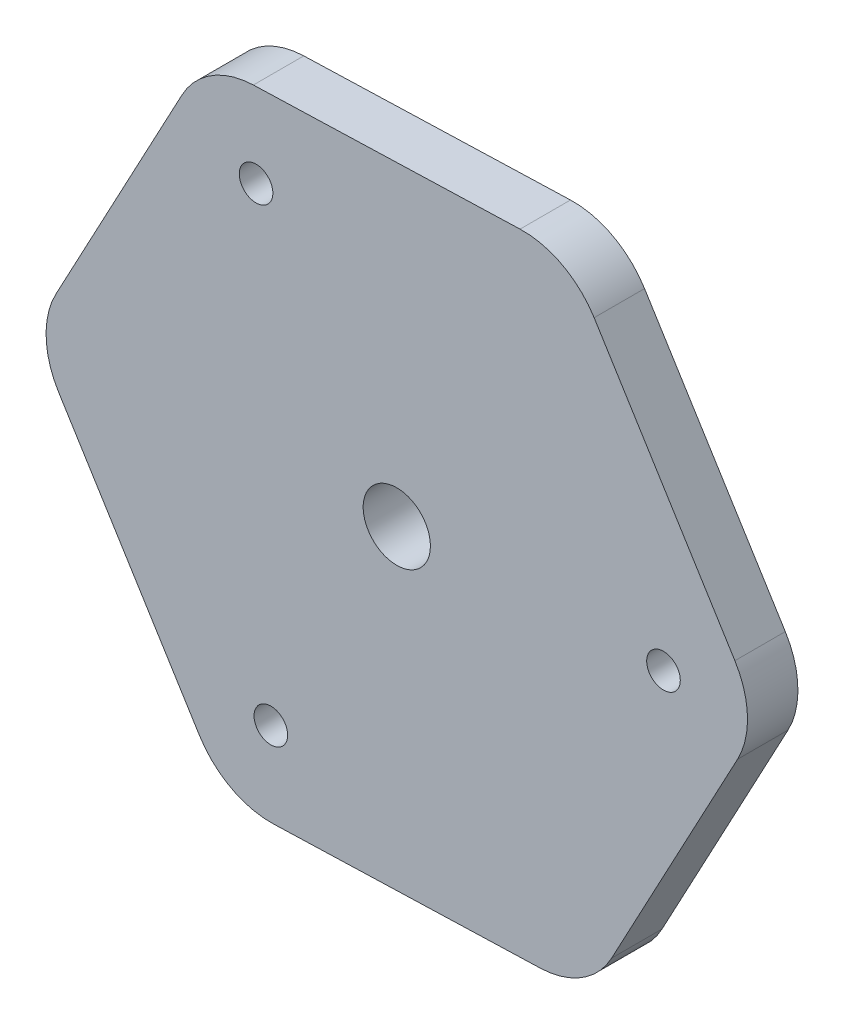
ISO-10303-21;
HEADER;
FILE_DESCRIPTION(('STEP AP214'),'2;1');
FILE_NAME('part.step','',(''),(''),'','','');
FILE_SCHEMA(('AUTOMOTIVE_DESIGN { 1 0 10303 214 1 1 1 1 }'));
ENDSEC;
DATA;
#1=APPLICATION_CONTEXT('core data for automotive mechanical design processes');
#2=APPLICATION_PROTOCOL_DEFINITION('international standard','automotive_design',2000,#1);
#3=PRODUCT_CONTEXT('',#1,'mechanical');
#4=PRODUCT('Part','Part','',(#3));
#5=PRODUCT_RELATED_PRODUCT_CATEGORY('part','',(#4));
#6=PRODUCT_DEFINITION_FORMATION('','',#4);
#7=PRODUCT_DEFINITION_CONTEXT('part definition',#1,'design');
#8=PRODUCT_DEFINITION('design','',#6,#7);
#9=PRODUCT_DEFINITION_SHAPE('','',#8);
#10=(LENGTH_UNIT() NAMED_UNIT(*) SI_UNIT(.MILLI.,.METRE.));
#11=(NAMED_UNIT(*) PLANE_ANGLE_UNIT() SI_UNIT($,.RADIAN.));
#12=(NAMED_UNIT(*) SI_UNIT($,.STERADIAN.) SOLID_ANGLE_UNIT());
#13=UNCERTAINTY_MEASURE_WITH_UNIT(LENGTH_MEASURE(1.E-05),#10,'distance_accuracy_value','');
#14=(GEOMETRIC_REPRESENTATION_CONTEXT(3) GLOBAL_UNCERTAINTY_ASSIGNED_CONTEXT((#13)) GLOBAL_UNIT_ASSIGNED_CONTEXT((#10,
#11,#12)) REPRESENTATION_CONTEXT('',''));
#15=CARTESIAN_POINT('',(0.,0.,0.));
#16=DIRECTION('',(0.,0.,1.));
#17=DIRECTION('',(1.,0.,0.));
#18=AXIS2_PLACEMENT_3D('',#15,#16,#17);
#19=CARTESIAN_POINT('',(-61.4755980269831,147.839468182783,6.));
#20=DIRECTION('',(0.,0.,1.));
#21=DIRECTION('',(1.,0.,0.));
#22=AXIS2_PLACEMENT_3D('',#19,#20,#21);
#23=PLANE('',#22);
#24=CARTESIAN_POINT('',(-76.4646277765089,119.845498823279,6.));
#25=DIRECTION('',(0.,0.,1.));
#26=DIRECTION('',(1.,0.,0.));
#27=AXIS2_PLACEMENT_3D('',#24,#25,#26);
#28=CIRCLE('',#27,3.99999999999999);
#29=CARTESIAN_POINT('',(-72.464627776509,119.845498823279,6.));
#30=VERTEX_POINT('',#29);
#31=EDGE_CURVE('E298',#30,#30,#28,.T.);
#32=ORIENTED_EDGE('',*,*,#31,.F.);
#33=EDGE_LOOP('',(#32));
#34=FACE_BOUND('',#33,.T.);
#35=CARTESIAN_POINT('',(-91.4536575260408,91.8515294637691,6.));
#36=DIRECTION('',(0.,0.,1.));
#37=DIRECTION('',(1.,0.,0.));
#38=AXIS2_PLACEMENT_3D('',#35,#36,#37);
#39=CIRCLE('',#38,2.00000000000196);
#40=CARTESIAN_POINT('',(-89.4536575260388,91.8515294637691,6.));
#41=VERTEX_POINT('',#40);
#42=EDGE_CURVE('E165',#41,#41,#39,.T.);
#43=ORIENTED_EDGE('',*,*,#42,.F.);
#44=EDGE_LOOP('',(#43));
#45=FACE_BOUND('',#44,.T.);
#46=CARTESIAN_POINT('',(-61.4755980269831,147.839468182783,6.));
#47=DIRECTION('',(0.,0.,1.));
#48=DIRECTION('',(1.,0.,0.));
#49=AXIS2_PLACEMENT_3D('',#46,#47,#48);
#50=CIRCLE('',#49,9.99999999999992);
#51=CARTESIAN_POINT('',(-52.9797738010947,153.114027000619,6.));
#52=VERTEX_POINT('',#51);
#53=CARTESIAN_POINT('',(-61.7955878440381,157.834347197408,6.));
#54=VERTEX_POINT('',#53);
#55=EDGE_CURVE('E184',#52,#54,#50,.T.);
#56=ORIENTED_EDGE('',*,*,#55,.T.);
#57=DIRECTION('',(-0.999487901462449,-0.031998981705493,0.));
#58=VECTOR('',#57,1.);
#59=CARTESIAN_POINT('',(-93.5335913369002,156.818243058827,6.));
#60=LINE('',#59,#58);
#61=CARTESIAN_POINT('',(-93.5335913369002,156.818243058827,6.));
#62=VERTEX_POINT('',#61);
#63=EDGE_CURVE('E112',#54,#62,#60,.T.);
#64=ORIENTED_EDGE('',*,*,#63,.T.);
#65=CARTESIAN_POINT('',(-93.2136015198451,146.823364044203,6.));
#66=DIRECTION('',(0.,0.,1.));
#67=DIRECTION('',(1.,0.,0.));
#68=AXIS2_PLACEMENT_3D('',#65,#66,#67);
#69=CIRCLE('',#68,9.99999999999997);
#70=CARTESIAN_POINT('',(-102.029415562789,151.543684240993,6.));
#71=VERTEX_POINT('',#70);
#72=EDGE_CURVE('E211',#62,#71,#69,.T.);
#73=ORIENTED_EDGE('',*,*,#72,.T.);
#74=DIRECTION('',(-0.47203201967905,-0.881581404294417,0.));
#75=VECTOR('',#74,1.);
#76=CARTESIAN_POINT('',(-117.01844531232,123.549714881486,6.));
#77=LINE('',#76,#75);
#78=CARTESIAN_POINT('',(-117.01844531232,123.549714881486,6.));
#79=VERTEX_POINT('',#78);
#80=EDGE_CURVE('E230',#71,#79,#77,.T.);
#81=ORIENTED_EDGE('',*,*,#80,.T.);
#82=CARTESIAN_POINT('',(-108.202631269376,118.829394684695,6.));
#83=DIRECTION('',(0.,0.,1.));
#84=DIRECTION('',(1.,0.,0.));
#85=AXIS2_PLACEMENT_3D('',#82,#83,#84);
#86=CIRCLE('',#85,10.);
#87=CARTESIAN_POINT('',(-116.698455495264,113.55483586686,6.));
#88=VERTEX_POINT('',#87);
#89=EDGE_CURVE('E227',#79,#88,#86,.T.);
#90=ORIENTED_EDGE('',*,*,#89,.T.);
#91=DIRECTION('',(0.527455881783555,-0.849582422588846,0.));
#92=VECTOR('',#91,1.);
#93=CARTESIAN_POINT('',(-99.9494817519277,86.5769706459347,6.));
#94=LINE('',#93,#92);
#95=CARTESIAN_POINT('',(-99.9494817519277,86.5769706459347,6.));
#96=VERTEX_POINT('',#95);
#97=EDGE_CURVE('E229',#88,#96,#94,.T.);
#98=ORIENTED_EDGE('',*,*,#97,.T.);
#99=CARTESIAN_POINT('',(-91.4536575260393,91.8515294637702,6.));
#100=DIRECTION('',(0.,0.,1.));
#101=DIRECTION('',(1.,0.,0.));
#102=AXIS2_PLACEMENT_3D('',#99,#100,#101);
#103=CIRCLE('',#102,9.99999999999993);
#104=CARTESIAN_POINT('',(-91.1336677089843,81.8566504491457,6.));
#105=VERTEX_POINT('',#104);
#106=EDGE_CURVE('E232',#96,#105,#103,.T.);
#107=ORIENTED_EDGE('',*,*,#106,.T.);
#108=DIRECTION('',(0.99948790146245,0.0319989817054847,0.));
#109=VECTOR('',#108,1.);
#110=CARTESIAN_POINT('',(-59.3956642161223,82.8727545877258,6.));
#111=LINE('',#110,#109);
#112=CARTESIAN_POINT('',(-59.3956642161223,82.8727545877259,6.));
#113=VERTEX_POINT('',#112);
#114=EDGE_CURVE('E238',#105,#113,#111,.T.);
#115=ORIENTED_EDGE('',*,*,#114,.T.);
#116=CARTESIAN_POINT('',(-59.7156540331771,92.8676336023503,6.));
#117=DIRECTION('',(0.,0.,1.));
#118=DIRECTION('',(1.,0.,0.));
#119=AXIS2_PLACEMENT_3D('',#116,#117,#118);
#120=CIRCLE('',#119,9.99999999999996);
#121=CARTESIAN_POINT('',(-50.899839990233,88.1473134055599,6.));
#122=VERTEX_POINT('',#121);
#123=EDGE_CURVE('E143',#113,#122,#120,.T.);
#124=ORIENTED_EDGE('',*,*,#123,.T.);
#125=DIRECTION('',(0.472032019679043,0.881581404294421,0.));
#126=VECTOR('',#125,1.);
#127=CARTESIAN_POINT('',(-35.9108102407028,116.141282765068,6.));
#128=LINE('',#127,#126);
#129=CARTESIAN_POINT('',(-35.9108102407028,116.141282765068,6.));
#130=VERTEX_POINT('',#129);
#131=EDGE_CURVE('E137',#122,#130,#128,.T.);
#132=ORIENTED_EDGE('',*,*,#131,.T.);
#133=CARTESIAN_POINT('',(-44.7266242836469,120.861602961858,6.));
#134=DIRECTION('',(0.,0.,1.));
#135=DIRECTION('',(1.,0.,0.));
#136=AXIS2_PLACEMENT_3D('',#133,#134,#135);
#137=CIRCLE('',#136,9.99999999999992);
#138=CARTESIAN_POINT('',(-36.2308000577584,126.136161779693,6.));
#139=VERTEX_POINT('',#138);
#140=EDGE_CURVE('E141',#130,#139,#137,.T.);
#141=ORIENTED_EDGE('',*,*,#140,.T.);
#142=DIRECTION('',(-0.527455881783545,0.849582422588852,0.));
#143=VECTOR('',#142,1.);
#144=CARTESIAN_POINT('',(-52.9797738010947,153.114027000619,6.));
#145=LINE('',#144,#143);
#146=EDGE_CURVE('E57',#139,#52,#145,.T.);
#147=ORIENTED_EDGE('',*,*,#146,.T.);
#148=EDGE_LOOP('',(#56,#64,#73,#81,#90,#98,#107,#115,#124,#132,#141,#147));
#149=FACE_BOUND('',#148,.T.);
#150=CARTESIAN_POINT('',(-44.7266242836489,120.861602961845,6.));
#151=DIRECTION('',(0.,0.,1.));
#152=DIRECTION('',(1.,0.,0.));
#153=AXIS2_PLACEMENT_3D('',#150,#151,#152);
#154=CIRCLE('',#153,2.00000000000573);
#155=CARTESIAN_POINT('',(-42.7266242836432,120.861602961845,6.));
#156=VERTEX_POINT('',#155);
#157=EDGE_CURVE('E304',#156,#156,#154,.T.);
#158=ORIENTED_EDGE('',*,*,#157,.F.);
#159=EDGE_LOOP('',(#158));
#160=FACE_BOUND('',#159,.T.);
#161=CARTESIAN_POINT('',(-93.2136015198514,146.823364044204,6.));
#162=DIRECTION('',(0.,0.,1.));
#163=DIRECTION('',(1.,0.,0.));
#164=AXIS2_PLACEMENT_3D('',#161,#162,#163);
#165=CIRCLE('',#164,2.00000000001048);
#166=CARTESIAN_POINT('',(-91.2136015198409,146.823364044204,6.));
#167=VERTEX_POINT('',#166);
#168=EDGE_CURVE('E289',#167,#167,#165,.T.);
#169=ORIENTED_EDGE('',*,*,#168,.F.);
#170=EDGE_LOOP('',(#169));
#171=FACE_BOUND('',#170,.T.);
#172=ADVANCED_FACE('F40',(#34,#45,#149,#160,#171),#23,.T.);
#173=CARTESIAN_POINT('',(-61.4755980269831,147.839468182783,0.));
#174=DIRECTION('',(0.,0.,1.));
#175=DIRECTION('',(1.,0.,0.));
#176=AXIS2_PLACEMENT_3D('',#173,#174,#175);
#177=PLANE('',#176);
#178=CARTESIAN_POINT('',(-61.4755980269831,147.839468182783,0.));
#179=DIRECTION('',(0.,0.,1.));
#180=DIRECTION('',(1.,0.,0.));
#181=AXIS2_PLACEMENT_3D('',#178,#179,#180);
#182=CIRCLE('',#181,9.99999999999992);
#183=CARTESIAN_POINT('',(-52.9797738010947,153.114027000619,0.));
#184=VERTEX_POINT('',#183);
#185=CARTESIAN_POINT('',(-61.7955878440381,157.834347197408,0.));
#186=VERTEX_POINT('',#185);
#187=EDGE_CURVE('E161',#184,#186,#182,.T.);
#188=ORIENTED_EDGE('',*,*,#187,.F.);
#189=DIRECTION('',(-0.527455881783545,0.849582422588852,0.));
#190=VECTOR('',#189,1.);
#191=CARTESIAN_POINT('',(-52.9797738010947,153.114027000619,0.));
#192=LINE('',#191,#190);
#193=CARTESIAN_POINT('',(-36.2308000577584,126.136161779693,0.));
#194=VERTEX_POINT('',#193);
#195=EDGE_CURVE('E104',#194,#184,#192,.T.);
#196=ORIENTED_EDGE('',*,*,#195,.F.);
#197=CARTESIAN_POINT('',(-44.7266242836469,120.861602961858,0.));
#198=DIRECTION('',(0.,0.,1.));
#199=DIRECTION('',(1.,0.,0.));
#200=AXIS2_PLACEMENT_3D('',#197,#198,#199);
#201=CIRCLE('',#200,9.99999999999992);
#202=CARTESIAN_POINT('',(-35.9108102407028,116.141282765068,0.));
#203=VERTEX_POINT('',#202);
#204=EDGE_CURVE('E98',#203,#194,#201,.T.);
#205=ORIENTED_EDGE('',*,*,#204,.F.);
#206=DIRECTION('',(0.472032019679043,0.881581404294421,0.));
#207=VECTOR('',#206,1.);
#208=CARTESIAN_POINT('',(-35.9108102407028,116.141282765068,0.));
#209=LINE('',#208,#207);
#210=CARTESIAN_POINT('',(-50.899839990233,88.1473134055599,0.));
#211=VERTEX_POINT('',#210);
#212=EDGE_CURVE('E151',#211,#203,#209,.T.);
#213=ORIENTED_EDGE('',*,*,#212,.F.);
#214=CARTESIAN_POINT('',(-59.7156540331771,92.8676336023503,0.));
#215=DIRECTION('',(0.,0.,1.));
#216=DIRECTION('',(1.,0.,0.));
#217=AXIS2_PLACEMENT_3D('',#214,#215,#216);
#218=CIRCLE('',#217,9.99999999999996);
#219=CARTESIAN_POINT('',(-59.3956642161223,82.8727545877259,0.));
#220=VERTEX_POINT('',#219);
#221=EDGE_CURVE('E179',#220,#211,#218,.T.);
#222=ORIENTED_EDGE('',*,*,#221,.F.);
#223=DIRECTION('',(0.99948790146245,0.0319989817054847,0.));
#224=VECTOR('',#223,1.);
#225=CARTESIAN_POINT('',(-59.3956642161223,82.8727545877258,0.));
#226=LINE('',#225,#224);
#227=CARTESIAN_POINT('',(-91.1336677089843,81.8566504491457,0.));
#228=VERTEX_POINT('',#227);
#229=EDGE_CURVE('E177',#228,#220,#226,.T.);
#230=ORIENTED_EDGE('',*,*,#229,.F.);
#231=CARTESIAN_POINT('',(-91.4536575260393,91.8515294637702,0.));
#232=DIRECTION('',(0.,0.,1.));
#233=DIRECTION('',(1.,0.,0.));
#234=AXIS2_PLACEMENT_3D('',#231,#232,#233);
#235=CIRCLE('',#234,9.99999999999993);
#236=CARTESIAN_POINT('',(-99.9494817519277,86.5769706459347,0.));
#237=VERTEX_POINT('',#236);
#238=EDGE_CURVE('E175',#237,#228,#235,.T.);
#239=ORIENTED_EDGE('',*,*,#238,.F.);
#240=DIRECTION('',(0.527455881783555,-0.849582422588846,0.));
#241=VECTOR('',#240,1.);
#242=CARTESIAN_POINT('',(-99.9494817519277,86.5769706459347,0.));
#243=LINE('',#242,#241);
#244=CARTESIAN_POINT('',(-116.698455495264,113.55483586686,0.));
#245=VERTEX_POINT('',#244);
#246=EDGE_CURVE('E173',#245,#237,#243,.T.);
#247=ORIENTED_EDGE('',*,*,#246,.F.);
#248=CARTESIAN_POINT('',(-108.202631269376,118.829394684695,0.));
#249=DIRECTION('',(0.,0.,1.));
#250=DIRECTION('',(1.,0.,0.));
#251=AXIS2_PLACEMENT_3D('',#248,#249,#250);
#252=CIRCLE('',#251,10.);
#253=CARTESIAN_POINT('',(-117.01844531232,123.549714881486,0.));
#254=VERTEX_POINT('',#253);
#255=EDGE_CURVE('E171',#254,#245,#252,.T.);
#256=ORIENTED_EDGE('',*,*,#255,.F.);
#257=DIRECTION('',(-0.47203201967905,-0.881581404294417,0.));
#258=VECTOR('',#257,1.);
#259=CARTESIAN_POINT('',(-117.01844531232,123.549714881486,0.));
#260=LINE('',#259,#258);
#261=CARTESIAN_POINT('',(-102.029415562789,151.543684240993,0.));
#262=VERTEX_POINT('',#261);
#263=EDGE_CURVE('E169',#262,#254,#260,.T.);
#264=ORIENTED_EDGE('',*,*,#263,.F.);
#265=CARTESIAN_POINT('',(-93.2136015198451,146.823364044203,0.));
#266=DIRECTION('',(0.,0.,1.));
#267=DIRECTION('',(1.,0.,0.));
#268=AXIS2_PLACEMENT_3D('',#265,#266,#267);
#269=CIRCLE('',#268,9.99999999999997);
#270=CARTESIAN_POINT('',(-93.5335913369002,156.818243058827,0.));
#271=VERTEX_POINT('',#270);
#272=EDGE_CURVE('E167',#271,#262,#269,.T.);
#273=ORIENTED_EDGE('',*,*,#272,.F.);
#274=DIRECTION('',(-0.999487901462449,-0.031998981705493,0.));
#275=VECTOR('',#274,1.);
#276=CARTESIAN_POINT('',(-93.5335913369002,156.818243058827,0.));
#277=LINE('',#276,#275);
#278=EDGE_CURVE('E164',#186,#271,#277,.T.);
#279=ORIENTED_EDGE('',*,*,#278,.F.);
#280=EDGE_LOOP('',(#188,#196,#205,#213,#222,#230,#239,#247,#256,#264,#273,#279));
#281=FACE_BOUND('',#280,.T.);
#282=CARTESIAN_POINT('',(-91.4536575260408,91.8515294637691,0.));
#283=DIRECTION('',(0.,0.,1.));
#284=DIRECTION('',(1.,0.,0.));
#285=AXIS2_PLACEMENT_3D('',#282,#283,#284);
#286=CIRCLE('',#285,2.00000000000196);
#287=CARTESIAN_POINT('',(-89.4536575260388,91.8515294637691,0.));
#288=VERTEX_POINT('',#287);
#289=EDGE_CURVE('E307',#288,#288,#286,.T.);
#290=ORIENTED_EDGE('',*,*,#289,.T.);
#291=EDGE_LOOP('',(#290));
#292=FACE_BOUND('',#291,.T.);
#293=CARTESIAN_POINT('',(-44.7266242836489,120.861602961845,0.));
#294=DIRECTION('',(0.,0.,1.));
#295=DIRECTION('',(1.,0.,0.));
#296=AXIS2_PLACEMENT_3D('',#293,#294,#295);
#297=CIRCLE('',#296,2.00000000000573);
#298=CARTESIAN_POINT('',(-42.7266242836432,120.861602961845,0.));
#299=VERTEX_POINT('',#298);
#300=EDGE_CURVE('E301',#299,#299,#297,.T.);
#301=ORIENTED_EDGE('',*,*,#300,.T.);
#302=EDGE_LOOP('',(#301));
#303=FACE_BOUND('',#302,.T.);
#304=CARTESIAN_POINT('',(-76.4646277765089,119.845498823279,0.));
#305=DIRECTION('',(0.,0.,1.));
#306=DIRECTION('',(1.,0.,0.));
#307=AXIS2_PLACEMENT_3D('',#304,#305,#306);
#308=CIRCLE('',#307,3.99999999999999);
#309=CARTESIAN_POINT('',(-72.464627776509,119.845498823279,0.));
#310=VERTEX_POINT('',#309);
#311=EDGE_CURVE('E295',#310,#310,#308,.T.);
#312=ORIENTED_EDGE('',*,*,#311,.T.);
#313=EDGE_LOOP('',(#312));
#314=FACE_BOUND('',#313,.T.);
#315=CARTESIAN_POINT('',(-93.2136015198514,146.823364044204,0.));
#316=DIRECTION('',(0.,0.,1.));
#317=DIRECTION('',(1.,0.,0.));
#318=AXIS2_PLACEMENT_3D('',#315,#316,#317);
#319=CIRCLE('',#318,2.00000000001048);
#320=CARTESIAN_POINT('',(-91.2136015198409,146.823364044204,0.));
#321=VERTEX_POINT('',#320);
#322=EDGE_CURVE('E292',#321,#321,#319,.T.);
#323=ORIENTED_EDGE('',*,*,#322,.T.);
#324=EDGE_LOOP('',(#323));
#325=FACE_BOUND('',#324,.T.);
#326=ADVANCED_FACE('F215',(#281,#292,#303,#314,#325),#177,.F.);
#327=CARTESIAN_POINT('',(-61.4755980269831,147.839468182783,6.));
#328=DIRECTION('',(0.,0.,-1.));
#329=DIRECTION('',(-1.,0.,0.));
#330=AXIS2_PLACEMENT_3D('',#327,#328,#329);
#331=CYLINDRICAL_SURFACE('',#330,9.99999999999992);
#332=ORIENTED_EDGE('',*,*,#187,.T.);
#333=DIRECTION('',(0.,0.,-1.));
#334=VECTOR('',#333,1.);
#335=CARTESIAN_POINT('',(-61.7955878440381,157.834347197408,6.));
#336=LINE('',#335,#334);
#337=EDGE_CURVE('E11',#54,#186,#336,.T.);
#338=ORIENTED_EDGE('',*,*,#337,.F.);
#339=ORIENTED_EDGE('',*,*,#55,.F.);
#340=DIRECTION('',(0.,0.,-1.));
#341=VECTOR('',#340,1.);
#342=CARTESIAN_POINT('',(-52.9797738010947,153.114027000619,6.));
#343=LINE('',#342,#341);
#344=EDGE_CURVE('E157',#52,#184,#343,.T.);
#345=ORIENTED_EDGE('',*,*,#344,.T.);
#346=EDGE_LOOP('',(#332,#338,#339,#345));
#347=FACE_BOUND('',#346,.T.);
#348=ADVANCED_FACE('F42',(#347),#331,.T.);
#349=CARTESIAN_POINT('',(-93.5335913369002,156.818243058827,6.));
#350=DIRECTION('',(0.031998981705493,-0.99948790146245,0.));
#351=DIRECTION('',(0.99948790146245,0.031998981705493,0.));
#352=AXIS2_PLACEMENT_3D('',#349,#350,#351);
#353=PLANE('',#352);
#354=ORIENTED_EDGE('',*,*,#278,.T.);
#355=DIRECTION('',(0.,0.,-1.));
#356=VECTOR('',#355,1.);
#357=CARTESIAN_POINT('',(-93.5335913369002,156.818243058827,6.));
#358=LINE('',#357,#356);
#359=EDGE_CURVE('E49',#62,#271,#358,.T.);
#360=ORIENTED_EDGE('',*,*,#359,.F.);
#361=ORIENTED_EDGE('',*,*,#63,.F.);
#362=ORIENTED_EDGE('',*,*,#337,.T.);
#363=EDGE_LOOP('',(#354,#360,#361,#362));
#364=FACE_BOUND('',#363,.T.);
#365=ADVANCED_FACE('F427',(#364),#353,.F.);
#366=CARTESIAN_POINT('',(-93.2136015198451,146.823364044203,6.));
#367=DIRECTION('',(0.,0.,-1.));
#368=DIRECTION('',(-1.,0.,0.));
#369=AXIS2_PLACEMENT_3D('',#366,#367,#368);
#370=CYLINDRICAL_SURFACE('',#369,9.99999999999997);
#371=ORIENTED_EDGE('',*,*,#272,.T.);
#372=DIRECTION('',(0.,0.,-1.));
#373=VECTOR('',#372,1.);
#374=CARTESIAN_POINT('',(-102.029415562789,151.543684240993,6.));
#375=LINE('',#374,#373);
#376=EDGE_CURVE('E203',#71,#262,#375,.T.);
#377=ORIENTED_EDGE('',*,*,#376,.F.);
#378=ORIENTED_EDGE('',*,*,#72,.F.);
#379=ORIENTED_EDGE('',*,*,#359,.T.);
#380=EDGE_LOOP('',(#371,#377,#378,#379));
#381=FACE_BOUND('',#380,.T.);
#382=ADVANCED_FACE('F209',(#381),#370,.T.);
#383=CARTESIAN_POINT('',(-117.01844531232,123.549714881486,6.));
#384=DIRECTION('',(0.881581404294417,-0.47203201967905,0.));
#385=DIRECTION('',(0.47203201967905,0.881581404294417,0.));
#386=AXIS2_PLACEMENT_3D('',#383,#384,#385);
#387=PLANE('',#386);
#388=ORIENTED_EDGE('',*,*,#263,.T.);
#389=DIRECTION('',(0.,0.,-1.));
#390=VECTOR('',#389,1.);
#391=CARTESIAN_POINT('',(-117.01844531232,123.549714881486,6.));
#392=LINE('',#391,#390);
#393=EDGE_CURVE('E200',#79,#254,#392,.T.);
#394=ORIENTED_EDGE('',*,*,#393,.F.);
#395=ORIENTED_EDGE('',*,*,#80,.F.);
#396=ORIENTED_EDGE('',*,*,#376,.T.);
#397=EDGE_LOOP('',(#388,#394,#395,#396));
#398=FACE_BOUND('',#397,.T.);
#399=ADVANCED_FACE('F221',(#398),#387,.F.);
#400=CARTESIAN_POINT('',(-108.202631269376,118.829394684695,6.));
#401=DIRECTION('',(0.,0.,-1.));
#402=DIRECTION('',(-1.,0.,0.));
#403=AXIS2_PLACEMENT_3D('',#400,#401,#402);
#404=CYLINDRICAL_SURFACE('',#403,10.);
#405=ORIENTED_EDGE('',*,*,#255,.T.);
#406=DIRECTION('',(0.,0.,-1.));
#407=VECTOR('',#406,1.);
#408=CARTESIAN_POINT('',(-116.698455495264,113.55483586686,6.));
#409=LINE('',#408,#407);
#410=EDGE_CURVE('E197',#88,#245,#409,.T.);
#411=ORIENTED_EDGE('',*,*,#410,.F.);
#412=ORIENTED_EDGE('',*,*,#89,.F.);
#413=ORIENTED_EDGE('',*,*,#393,.T.);
#414=EDGE_LOOP('',(#405,#411,#412,#413));
#415=FACE_BOUND('',#414,.T.);
#416=ADVANCED_FACE('F225',(#415),#404,.T.);
#417=CARTESIAN_POINT('',(-99.9494817519277,86.5769706459347,6.));
#418=DIRECTION('',(0.849582422588846,0.527455881783555,0.));
#419=DIRECTION('',(-0.527455881783555,0.849582422588846,0.));
#420=AXIS2_PLACEMENT_3D('',#417,#418,#419);
#421=PLANE('',#420);
#422=ORIENTED_EDGE('',*,*,#246,.T.);
#423=DIRECTION('',(0.,0.,-1.));
#424=VECTOR('',#423,1.);
#425=CARTESIAN_POINT('',(-99.9494817519277,86.5769706459347,6.));
#426=LINE('',#425,#424);
#427=EDGE_CURVE('E194',#96,#237,#426,.T.);
#428=ORIENTED_EDGE('',*,*,#427,.F.);
#429=ORIENTED_EDGE('',*,*,#97,.F.);
#430=ORIENTED_EDGE('',*,*,#410,.T.);
#431=EDGE_LOOP('',(#422,#428,#429,#430));
#432=FACE_BOUND('',#431,.T.);
#433=ADVANCED_FACE('F388',(#432),#421,.F.);
#434=CARTESIAN_POINT('',(-91.4536575260393,91.8515294637702,6.));
#435=DIRECTION('',(0.,0.,-1.));
#436=DIRECTION('',(-1.,0.,0.));
#437=AXIS2_PLACEMENT_3D('',#434,#435,#436);
#438=CYLINDRICAL_SURFACE('',#437,9.99999999999993);
#439=ORIENTED_EDGE('',*,*,#238,.T.);
#440=DIRECTION('',(0.,0.,-1.));
#441=VECTOR('',#440,1.);
#442=CARTESIAN_POINT('',(-91.1336677089843,81.8566504491457,6.));
#443=LINE('',#442,#441);
#444=EDGE_CURVE('E191',#105,#228,#443,.T.);
#445=ORIENTED_EDGE('',*,*,#444,.F.);
#446=ORIENTED_EDGE('',*,*,#106,.F.);
#447=ORIENTED_EDGE('',*,*,#427,.T.);
#448=EDGE_LOOP('',(#439,#445,#446,#447));
#449=FACE_BOUND('',#448,.T.);
#450=ADVANCED_FACE('F378',(#449),#438,.T.);
#451=CARTESIAN_POINT('',(-59.3956642161223,82.8727545877258,6.));
#452=DIRECTION('',(-0.0319989817054847,0.99948790146245,0.));
#453=DIRECTION('',(-0.99948790146245,-0.0319989817054847,0.));
#454=AXIS2_PLACEMENT_3D('',#451,#452,#453);
#455=PLANE('',#454);
#456=ORIENTED_EDGE('',*,*,#229,.T.);
#457=DIRECTION('',(0.,0.,-1.));
#458=VECTOR('',#457,1.);
#459=CARTESIAN_POINT('',(-59.3956642161223,82.8727545877259,6.));
#460=LINE('',#459,#458);
#461=EDGE_CURVE('E188',#113,#220,#460,.T.);
#462=ORIENTED_EDGE('',*,*,#461,.F.);
#463=ORIENTED_EDGE('',*,*,#114,.F.);
#464=ORIENTED_EDGE('',*,*,#444,.T.);
#465=EDGE_LOOP('',(#456,#462,#463,#464));
#466=FACE_BOUND('',#465,.T.);
#467=ADVANCED_FACE('F244',(#466),#455,.F.);
#468=CARTESIAN_POINT('',(-59.7156540331771,92.8676336023503,6.));
#469=DIRECTION('',(0.,0.,-1.));
#470=DIRECTION('',(-1.,0.,0.));
#471=AXIS2_PLACEMENT_3D('',#468,#469,#470);
#472=CYLINDRICAL_SURFACE('',#471,9.99999999999996);
#473=ORIENTED_EDGE('',*,*,#221,.T.);
#474=DIRECTION('',(0.,0.,-1.));
#475=VECTOR('',#474,1.);
#476=CARTESIAN_POINT('',(-50.899839990233,88.1473134055599,6.));
#477=LINE('',#476,#475);
#478=EDGE_CURVE('E152',#122,#211,#477,.T.);
#479=ORIENTED_EDGE('',*,*,#478,.F.);
#480=ORIENTED_EDGE('',*,*,#123,.F.);
#481=ORIENTED_EDGE('',*,*,#461,.T.);
#482=EDGE_LOOP('',(#473,#479,#480,#481));
#483=FACE_BOUND('',#482,.T.);
#484=ADVANCED_FACE('F248',(#483),#472,.T.);
#485=CARTESIAN_POINT('',(-35.9108102407028,116.141282765068,6.));
#486=DIRECTION('',(-0.881581404294421,0.472032019679043,0.));
#487=DIRECTION('',(-0.472032019679043,-0.881581404294421,0.));
#488=AXIS2_PLACEMENT_3D('',#485,#486,#487);
#489=PLANE('',#488);
#490=ORIENTED_EDGE('',*,*,#212,.T.);
#491=DIRECTION('',(0.,0.,-1.));
#492=VECTOR('',#491,1.);
#493=CARTESIAN_POINT('',(-35.9108102407028,116.141282765068,6.));
#494=LINE('',#493,#492);
#495=EDGE_CURVE('E148',#130,#203,#494,.T.);
#496=ORIENTED_EDGE('',*,*,#495,.F.);
#497=ORIENTED_EDGE('',*,*,#131,.F.);
#498=ORIENTED_EDGE('',*,*,#478,.T.);
#499=EDGE_LOOP('',(#490,#496,#497,#498));
#500=FACE_BOUND('',#499,.T.);
#501=ADVANCED_FACE('F149',(#500),#489,.F.);
#502=CARTESIAN_POINT('',(-44.7266242836469,120.861602961858,6.));
#503=DIRECTION('',(0.,0.,-1.));
#504=DIRECTION('',(-1.,0.,0.));
#505=AXIS2_PLACEMENT_3D('',#502,#503,#504);
#506=CYLINDRICAL_SURFACE('',#505,9.99999999999992);
#507=ORIENTED_EDGE('',*,*,#204,.T.);
#508=DIRECTION('',(0.,0.,-1.));
#509=VECTOR('',#508,1.);
#510=CARTESIAN_POINT('',(-36.2308000577584,126.136161779693,6.));
#511=LINE('',#510,#509);
#512=EDGE_CURVE('E153',#139,#194,#511,.T.);
#513=ORIENTED_EDGE('',*,*,#512,.F.);
#514=ORIENTED_EDGE('',*,*,#140,.F.);
#515=ORIENTED_EDGE('',*,*,#495,.T.);
#516=EDGE_LOOP('',(#507,#513,#514,#515));
#517=FACE_BOUND('',#516,.T.);
#518=ADVANCED_FACE('F155',(#517),#506,.T.);
#519=CARTESIAN_POINT('',(-52.9797738010947,153.114027000619,6.));
#520=DIRECTION('',(-0.849582422588852,-0.527455881783546,0.));
#521=DIRECTION('',(0.527455881783546,-0.849582422588852,0.));
#522=AXIS2_PLACEMENT_3D('',#519,#520,#521);
#523=PLANE('',#522);
#524=ORIENTED_EDGE('',*,*,#195,.T.);
#525=ORIENTED_EDGE('',*,*,#344,.F.);
#526=ORIENTED_EDGE('',*,*,#146,.F.);
#527=ORIENTED_EDGE('',*,*,#512,.T.);
#528=EDGE_LOOP('',(#524,#525,#526,#527));
#529=FACE_BOUND('',#528,.T.);
#530=ADVANCED_FACE('F252',(#529),#523,.F.);
#531=CARTESIAN_POINT('',(-91.4536575260408,91.8515294637691,6.));
#532=DIRECTION('',(0.,0.,-1.));
#533=DIRECTION('',(-1.,0.,0.));
#534=AXIS2_PLACEMENT_3D('',#531,#532,#533);
#535=CYLINDRICAL_SURFACE('',#534,2.00000000000196);
#536=ORIENTED_EDGE('',*,*,#42,.T.);
#537=EDGE_LOOP('',(#536));
#538=FACE_BOUND('',#537,.T.);
#539=ORIENTED_EDGE('',*,*,#289,.F.);
#540=EDGE_LOOP('',(#539));
#541=FACE_BOUND('',#540,.T.);
#542=ADVANCED_FACE('F254',(#538,#541),#535,.F.);
#543=CARTESIAN_POINT('',(-44.7266242836489,120.861602961845,6.));
#544=DIRECTION('',(0.,0.,-1.));
#545=DIRECTION('',(-1.,0.,0.));
#546=AXIS2_PLACEMENT_3D('',#543,#544,#545);
#547=CYLINDRICAL_SURFACE('',#546,2.00000000000573);
#548=ORIENTED_EDGE('',*,*,#157,.T.);
#549=EDGE_LOOP('',(#548));
#550=FACE_BOUND('',#549,.T.);
#551=ORIENTED_EDGE('',*,*,#300,.F.);
#552=EDGE_LOOP('',(#551));
#553=FACE_BOUND('',#552,.T.);
#554=ADVANCED_FACE('F260',(#550,#553),#547,.F.);
#555=CARTESIAN_POINT('',(-76.4646277765089,119.845498823279,6.));
#556=DIRECTION('',(0.,0.,-1.));
#557=DIRECTION('',(-1.,0.,0.));
#558=AXIS2_PLACEMENT_3D('',#555,#556,#557);
#559=CYLINDRICAL_SURFACE('',#558,3.99999999999999);
#560=ORIENTED_EDGE('',*,*,#31,.T.);
#561=EDGE_LOOP('',(#560));
#562=FACE_BOUND('',#561,.T.);
#563=ORIENTED_EDGE('',*,*,#311,.F.);
#564=EDGE_LOOP('',(#563));
#565=FACE_BOUND('',#564,.T.);
#566=ADVANCED_FACE('F276',(#562,#565),#559,.F.);
#567=CARTESIAN_POINT('',(-93.2136015198514,146.823364044204,6.));
#568=DIRECTION('',(0.,0.,-1.));
#569=DIRECTION('',(-1.,0.,0.));
#570=AXIS2_PLACEMENT_3D('',#567,#568,#569);
#571=CYLINDRICAL_SURFACE('',#570,2.00000000001048);
#572=ORIENTED_EDGE('',*,*,#168,.T.);
#573=EDGE_LOOP('',(#572));
#574=FACE_BOUND('',#573,.T.);
#575=ORIENTED_EDGE('',*,*,#322,.F.);
#576=EDGE_LOOP('',(#575));
#577=FACE_BOUND('',#576,.T.);
#578=ADVANCED_FACE('F280',(#574,#577),#571,.F.);
#579=CLOSED_SHELL('',(#172,#326,#348,#365,#382,#399,#416,#433,#450,#467,#484,#501,#518,#530,
#542,#554,#566,#578));
#580=MANIFOLD_SOLID_BREP('B2',#579);
#581=ADVANCED_BREP_SHAPE_REPRESENTATION('',(#18,#580),#14);
#582=SHAPE_DEFINITION_REPRESENTATION(#9,#581);
ENDSEC;
END-ISO-10303-21;
